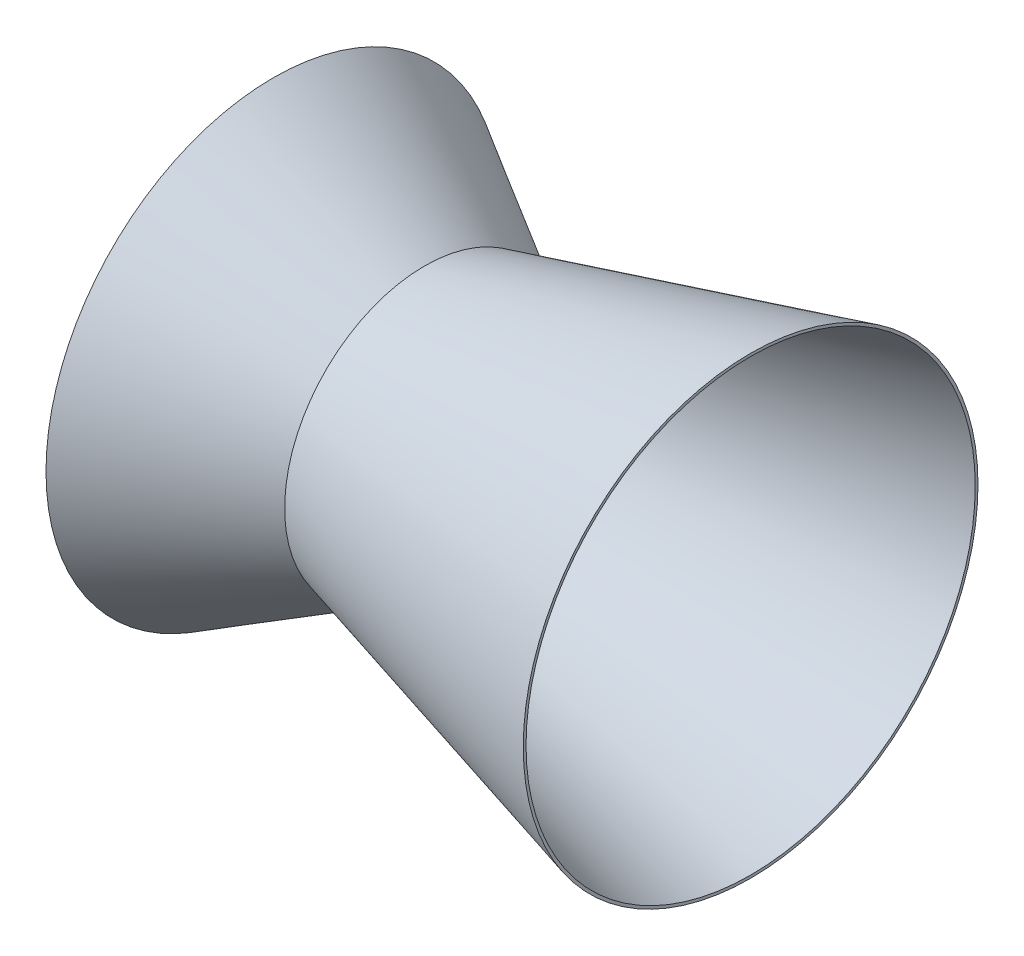
ISO-10303-21;
HEADER;
FILE_DESCRIPTION(('STEP AP214'),'2;1');
FILE_NAME('part.step','',(''),(''),'','','');
FILE_SCHEMA(('AUTOMOTIVE_DESIGN { 1 0 10303 214 1 1 1 1 }'));
ENDSEC;
DATA;
#1=APPLICATION_CONTEXT('core data for automotive mechanical design processes');
#2=APPLICATION_PROTOCOL_DEFINITION('international standard','automotive_design',2000,#1);
#3=PRODUCT_CONTEXT('',#1,'mechanical');
#4=PRODUCT('Part','Part','',(#3));
#5=PRODUCT_RELATED_PRODUCT_CATEGORY('part','',(#4));
#6=PRODUCT_DEFINITION_FORMATION('','',#4);
#7=PRODUCT_DEFINITION_CONTEXT('part definition',#1,'design');
#8=PRODUCT_DEFINITION('design','',#6,#7);
#9=PRODUCT_DEFINITION_SHAPE('','',#8);
#10=(LENGTH_UNIT() NAMED_UNIT(*) SI_UNIT(.MILLI.,.METRE.));
#11=(NAMED_UNIT(*) PLANE_ANGLE_UNIT() SI_UNIT($,.RADIAN.));
#12=(NAMED_UNIT(*) SI_UNIT($,.STERADIAN.) SOLID_ANGLE_UNIT());
#13=UNCERTAINTY_MEASURE_WITH_UNIT(LENGTH_MEASURE(1.E-05),#10,'distance_accuracy_value','');
#14=(GEOMETRIC_REPRESENTATION_CONTEXT(3) GLOBAL_UNCERTAINTY_ASSIGNED_CONTEXT((#13)) GLOBAL_UNIT_ASSIGNED_CONTEXT((#10,
#11,#12)) REPRESENTATION_CONTEXT('',''));
#15=CARTESIAN_POINT('',(0.,0.,0.));
#16=DIRECTION('',(0.,0.,1.));
#17=DIRECTION('',(1.,0.,0.));
#18=AXIS2_PLACEMENT_3D('',#15,#16,#17);
#19=CARTESIAN_POINT('',(0.,0.,0.));
#20=DIRECTION('',(-1.,0.,0.));
#21=DIRECTION('',(0.,-1.,0.));
#22=AXIS2_PLACEMENT_3D('',#19,#20,#21);
#23=PLANE('',#22);
#24=CARTESIAN_POINT('',(0.,0.,0.));
#25=DIRECTION('',(-1.,0.,0.));
#26=DIRECTION('',(0.,-1.,0.));
#27=AXIS2_PLACEMENT_3D('',#24,#25,#26);
#28=CIRCLE('',#27,83.8452974859874);
#29=CARTESIAN_POINT('',(0.,-83.8452974859874,0.));
#30=VERTEX_POINT('',#29);
#31=EDGE_CURVE('E51',#30,#30,#28,.F.);
#32=ORIENTED_EDGE('',*,*,#31,.T.);
#33=EDGE_LOOP('',(#32));
#34=FACE_BOUND('',#33,.T.);
#35=CARTESIAN_POINT('',(0.,0.,0.));
#36=DIRECTION('',(1.,0.,0.));
#37=DIRECTION('',(0.,1.,0.));
#38=AXIS2_PLACEMENT_3D('',#35,#36,#37);
#39=CIRCLE('',#38,85.);
#40=CARTESIAN_POINT('',(0.,85.,0.));
#41=VERTEX_POINT('',#40);
#42=EDGE_CURVE('E10',#41,#41,#39,.T.);
#43=ORIENTED_EDGE('',*,*,#42,.F.);
#44=EDGE_LOOP('',(#43));
#45=FACE_BOUND('',#44,.T.);
#46=ADVANCED_FACE('F37',(#34,#45),#23,.T.);
#47=CARTESIAN_POINT('',(56.558,0.,0.));
#48=DIRECTION('',(-1.,0.,0.));
#49=DIRECTION('',(0.,-1.,0.));
#50=AXIS2_PLACEMENT_3D('',#47,#48,#49);
#51=CONICAL_SURFACE('',#50,52.346,0.52360173903571);
#52=ORIENTED_EDGE('',*,*,#42,.T.);
#53=EDGE_LOOP('',(#52));
#54=FACE_BOUND('',#53,.T.);
#55=CARTESIAN_POINT('',(56.558,0.,0.));
#56=DIRECTION('',(1.,0.,0.));
#57=DIRECTION('',(0.,1.,0.));
#58=AXIS2_PLACEMENT_3D('',#55,#56,#57);
#59=CIRCLE('',#58,52.346);
#60=CARTESIAN_POINT('',(56.558,52.346,0.));
#61=VERTEX_POINT('',#60);
#62=EDGE_CURVE('E43',#61,#61,#59,.T.);
#63=ORIENTED_EDGE('',*,*,#62,.F.);
#64=EDGE_LOOP('',(#63));
#65=FACE_BOUND('',#64,.T.);
#66=ADVANCED_FACE('F79',(#54,#65),#51,.T.);
#67=CARTESIAN_POINT('',(178.42,0.,0.));
#68=DIRECTION('',(1.,0.,0.));
#69=DIRECTION('',(0.,1.,0.));
#70=AXIS2_PLACEMENT_3D('',#67,#68,#69);
#71=CONICAL_SURFACE('',#70,85.,0.261808387856129);
#72=ORIENTED_EDGE('',*,*,#62,.T.);
#73=EDGE_LOOP('',(#72));
#74=FACE_BOUND('',#73,.T.);
#75=CARTESIAN_POINT('',(178.42,0.,0.));
#76=DIRECTION('',(1.,0.,0.));
#77=DIRECTION('',(0.,1.,0.));
#78=AXIS2_PLACEMENT_3D('',#75,#76,#77);
#79=CIRCLE('',#78,85.);
#80=CARTESIAN_POINT('',(178.42,85.,0.));
#81=VERTEX_POINT('',#80);
#82=EDGE_CURVE('E47',#81,#81,#79,.T.);
#83=ORIENTED_EDGE('',*,*,#82,.F.);
#84=EDGE_LOOP('',(#83));
#85=FACE_BOUND('',#84,.T.);
#86=ADVANCED_FACE('F74',(#74,#85),#71,.T.);
#87=CARTESIAN_POINT('',(178.42,85.,0.));
#88=DIRECTION('',(1.,0.,0.));
#89=DIRECTION('',(0.,1.,0.));
#90=AXIS2_PLACEMENT_3D('',#87,#88,#89);
#91=PLANE('',#90);
#92=CARTESIAN_POINT('',(178.42,0.,0.));
#93=DIRECTION('',(1.,0.,0.));
#94=DIRECTION('',(0.,1.,0.));
#95=AXIS2_PLACEMENT_3D('',#92,#93,#94);
#96=CIRCLE('',#95,83.9647213229134);
#97=CARTESIAN_POINT('',(178.42,83.9647213229134,0.));
#98=VERTEX_POINT('',#97);
#99=EDGE_CURVE('E54',#98,#98,#96,.T.);
#100=ORIENTED_EDGE('',*,*,#99,.F.);
#101=EDGE_LOOP('',(#100));
#102=FACE_BOUND('',#101,.T.);
#103=ORIENTED_EDGE('',*,*,#82,.T.);
#104=EDGE_LOOP('',(#103));
#105=FACE_BOUND('',#104,.T.);
#106=ADVANCED_FACE('F71',(#102,#105),#91,.T.);
#107=CARTESIAN_POINT('',(56.0579974335901,0.,0.));
#108=DIRECTION('',(-1.,0.,0.));
#109=DIRECTION('',(0.,-1.,0.));
#110=AXIS2_PLACEMENT_3D('',#107,#108,#109);
#111=CONICAL_SURFACE('',#110,51.4799760779381,0.52360173903571);
#112=ORIENTED_EDGE('',*,*,#31,.F.);
#113=EDGE_LOOP('',(#112));
#114=FACE_BOUND('',#113,.T.);
#115=CARTESIAN_POINT('',(56.4167223566041,0.,0.));
#116=DIRECTION('',(1.,0.,0.));
#117=DIRECTION('',(0.,1.,0.));
#118=AXIS2_PLACEMENT_3D('',#115,#116,#117);
#119=CIRCLE('',#118,51.2728647296567);
#120=CARTESIAN_POINT('',(56.4167223566041,51.2728647296567,0.));
#121=VERTEX_POINT('',#120);
#122=EDGE_CURVE('E57',#121,#121,#119,.T.);
#123=ORIENTED_EDGE('',*,*,#122,.T.);
#124=EDGE_LOOP('',(#123));
#125=FACE_BOUND('',#124,.T.);
#126=ADVANCED_FACE('F63',(#114,#125),#111,.F.);
#127=CARTESIAN_POINT('',(178.678827738479,0.,0.));
#128=DIRECTION('',(1.,0.,0.));
#129=DIRECTION('',(0.,1.,0.));
#130=AXIS2_PLACEMENT_3D('',#127,#128,#129);
#131=CONICAL_SURFACE('',#130,84.0340765031362,0.261808387856129);
#132=ORIENTED_EDGE('',*,*,#122,.F.);
#133=EDGE_LOOP('',(#132));
#134=FACE_BOUND('',#133,.T.);
#135=ORIENTED_EDGE('',*,*,#99,.T.);
#136=EDGE_LOOP('',(#135));
#137=FACE_BOUND('',#136,.T.);
#138=ADVANCED_FACE('F65',(#134,#137),#131,.F.);
#139=CLOSED_SHELL('',(#46,#66,#86,#106,#126,#138));
#140=MANIFOLD_SOLID_BREP('B2',#139);
#141=ADVANCED_BREP_SHAPE_REPRESENTATION('',(#18,#140),#14);
#142=SHAPE_DEFINITION_REPRESENTATION(#9,#141);
ENDSEC;
END-ISO-10303-21;
